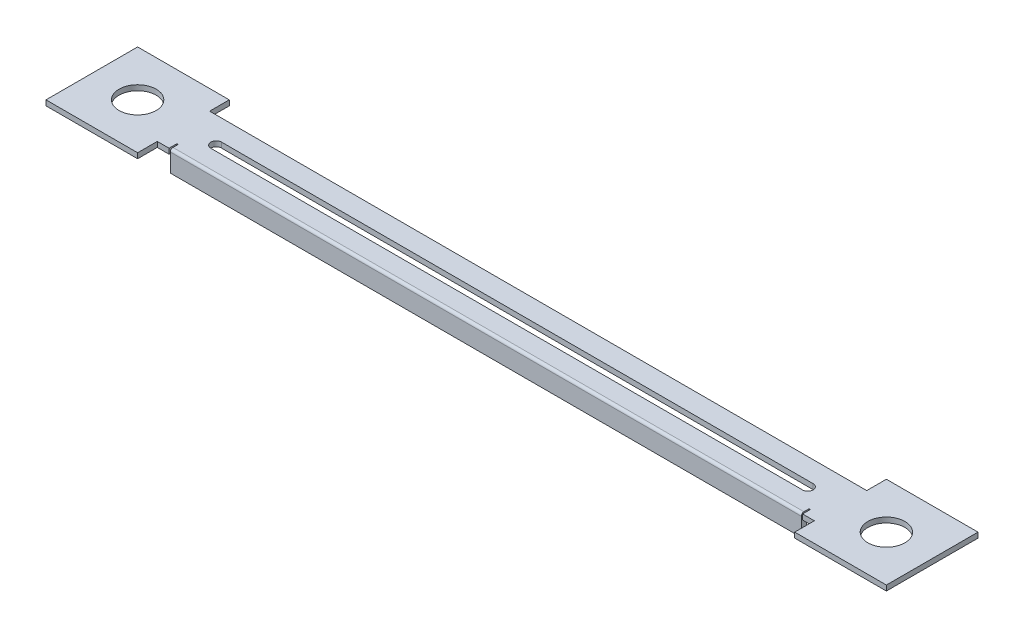
ISO-10303-21;
HEADER;
FILE_DESCRIPTION(('STEP AP214'),'2;1');
FILE_NAME('part.step','',(''),(''),'','','');
FILE_SCHEMA(('AUTOMOTIVE_DESIGN { 1 0 10303 214 1 1 1 1 }'));
ENDSEC;
DATA;
#1=APPLICATION_CONTEXT('core data for automotive mechanical design processes');
#2=APPLICATION_PROTOCOL_DEFINITION('international standard','automotive_design',2000,#1);
#3=PRODUCT_CONTEXT('',#1,'mechanical');
#4=PRODUCT('Part','Part','',(#3));
#5=PRODUCT_RELATED_PRODUCT_CATEGORY('part','',(#4));
#6=PRODUCT_DEFINITION_FORMATION('','',#4);
#7=PRODUCT_DEFINITION_CONTEXT('part definition',#1,'design');
#8=PRODUCT_DEFINITION('design','',#6,#7);
#9=PRODUCT_DEFINITION_SHAPE('','',#8);
#10=(LENGTH_UNIT() NAMED_UNIT(*) SI_UNIT(.MILLI.,.METRE.));
#11=(NAMED_UNIT(*) PLANE_ANGLE_UNIT() SI_UNIT($,.RADIAN.));
#12=(NAMED_UNIT(*) SI_UNIT($,.STERADIAN.) SOLID_ANGLE_UNIT());
#13=UNCERTAINTY_MEASURE_WITH_UNIT(LENGTH_MEASURE(1.E-05),#10,'distance_accuracy_value','');
#14=(GEOMETRIC_REPRESENTATION_CONTEXT(3) GLOBAL_UNCERTAINTY_ASSIGNED_CONTEXT((#13)) GLOBAL_UNIT_ASSIGNED_CONTEXT((#10,
#11,#12)) REPRESENTATION_CONTEXT('',''));
#15=CARTESIAN_POINT('',(0.,0.,0.));
#16=DIRECTION('',(0.,0.,1.));
#17=DIRECTION('',(1.,0.,0.));
#18=AXIS2_PLACEMENT_3D('',#15,#16,#17);
#19=CARTESIAN_POINT('',(17.5,2.,10.));
#20=DIRECTION('',(0.,0.,-1.));
#21=DIRECTION('',(-1.,0.,0.));
#22=AXIS2_PLACEMENT_3D('',#19,#20,#21);
#23=PLANE('',#22);
#24=DIRECTION('',(1.,0.,0.));
#25=VECTOR('',#24,1.);
#26=CARTESIAN_POINT('',(17.5,0.,10.));
#27=LINE('',#26,#25);
#28=CARTESIAN_POINT('',(17.5,0.,10.));
#29=VERTEX_POINT('',#28);
#30=CARTESIAN_POINT('',(22.,0.,10.));
#31=VERTEX_POINT('',#30);
#32=EDGE_CURVE('E429',#29,#31,#27,.T.);
#33=ORIENTED_EDGE('',*,*,#32,.T.);
#34=DIRECTION('',(0.,-1.,0.));
#35=VECTOR('',#34,1.);
#36=CARTESIAN_POINT('',(22.,2.,10.));
#37=LINE('',#36,#35);
#38=CARTESIAN_POINT('',(22.,2.,10.));
#39=VERTEX_POINT('',#38);
#40=EDGE_CURVE('E278',#39,#31,#37,.T.);
#41=ORIENTED_EDGE('',*,*,#40,.F.);
#42=DIRECTION('',(1.,0.,0.));
#43=VECTOR('',#42,1.);
#44=CARTESIAN_POINT('',(17.5,2.,10.));
#45=LINE('',#44,#43);
#46=CARTESIAN_POINT('',(17.5,2.,10.));
#47=VERTEX_POINT('',#46);
#48=EDGE_CURVE('E390',#47,#39,#45,.T.);
#49=ORIENTED_EDGE('',*,*,#48,.F.);
#50=DIRECTION('',(0.,-1.,0.));
#51=VECTOR('',#50,1.);
#52=CARTESIAN_POINT('',(17.5,2.,10.));
#53=LINE('',#52,#51);
#54=EDGE_CURVE('E505',#47,#29,#53,.T.);
#55=ORIENTED_EDGE('',*,*,#54,.T.);
#56=EDGE_LOOP('',(#33,#41,#49,#55));
#57=FACE_BOUND('',#56,.T.);
#58=ADVANCED_FACE('F39',(#57),#23,.F.);
#59=CARTESIAN_POINT('',(264.,2.,10.));
#60=VERTEX_POINT('',#59);
#61=CARTESIAN_POINT('',(268.5,2.,10.));
#62=VERTEX_POINT('',#61);
#63=EDGE_CURVE('E388',#60,#62,#45,.T.);
#64=ORIENTED_EDGE('',*,*,#63,.F.);
#65=DIRECTION('',(0.,1.,0.));
#66=VECTOR('',#65,1.);
#67=CARTESIAN_POINT('',(264.,2.,10.));
#68=LINE('',#67,#66);
#69=CARTESIAN_POINT('',(264.,0.,10.));
#70=VERTEX_POINT('',#69);
#71=EDGE_CURVE('E267',#70,#60,#68,.T.);
#72=ORIENTED_EDGE('',*,*,#71,.F.);
#73=CARTESIAN_POINT('',(268.5,0.,10.));
#74=VERTEX_POINT('',#73);
#75=EDGE_CURVE('E428',#70,#74,#27,.T.);
#76=ORIENTED_EDGE('',*,*,#75,.T.);
#77=DIRECTION('',(0.,-1.,0.));
#78=VECTOR('',#77,1.);
#79=CARTESIAN_POINT('',(268.5,2.,10.));
#80=LINE('',#79,#78);
#81=EDGE_CURVE('E501',#62,#74,#80,.T.);
#82=ORIENTED_EDGE('',*,*,#81,.F.);
#83=EDGE_LOOP('',(#64,#72,#76,#82));
#84=FACE_BOUND('',#83,.T.);
#85=ADVANCED_FACE('F572',(#84),#23,.F.);
#86=CARTESIAN_POINT('',(0.,0.,0.));
#87=DIRECTION('',(0.,1.,0.));
#88=DIRECTION('',(0.,0.,1.));
#89=AXIS2_PLACEMENT_3D('',#86,#87,#88);
#90=PLANE('',#89);
#91=DIRECTION('',(1.,0.,0.));
#92=VECTOR('',#91,1.);
#93=CARTESIAN_POINT('',(30.,0.,-2.05));
#94=LINE('',#93,#92);
#95=CARTESIAN_POINT('',(30.,0.,-2.05));
#96=VERTEX_POINT('',#95);
#97=CARTESIAN_POINT('',(256.,0.,-2.05));
#98=VERTEX_POINT('',#97);
#99=EDGE_CURVE('E258',#96,#98,#94,.T.);
#100=ORIENTED_EDGE('',*,*,#99,.F.);
#101=CARTESIAN_POINT('',(30.,0.,0.));
#102=DIRECTION('',(0.,-1.,0.));
#103=DIRECTION('',(0.,0.,-1.));
#104=AXIS2_PLACEMENT_3D('',#101,#102,#103);
#105=CIRCLE('',#104,2.05);
#106=CARTESIAN_POINT('',(30.,0.,2.05));
#107=VERTEX_POINT('',#106);
#108=EDGE_CURVE('E55',#107,#96,#105,.T.);
#109=ORIENTED_EDGE('',*,*,#108,.F.);
#110=DIRECTION('',(-1.,0.,0.));
#111=VECTOR('',#110,1.);
#112=CARTESIAN_POINT('',(30.,0.,2.05));
#113=LINE('',#112,#111);
#114=CARTESIAN_POINT('',(256.,0.,2.05));
#115=VERTEX_POINT('',#114);
#116=EDGE_CURVE('E245',#115,#107,#113,.T.);
#117=ORIENTED_EDGE('',*,*,#116,.F.);
#118=CARTESIAN_POINT('',(256.,0.,0.));
#119=DIRECTION('',(0.,-1.,0.));
#120=DIRECTION('',(0.,0.,-1.));
#121=AXIS2_PLACEMENT_3D('',#118,#119,#120);
#122=CIRCLE('',#121,2.05);
#123=EDGE_CURVE('E249',#98,#115,#122,.T.);
#124=ORIENTED_EDGE('',*,*,#123,.F.);
#125=EDGE_LOOP('',(#100,#109,#117,#124));
#126=FACE_BOUND('',#125,.T.);
#127=DIRECTION('',(0.,0.,1.));
#128=VECTOR('',#127,1.);
#129=CARTESIAN_POINT('',(263.5,0.,7.));
#130=LINE('',#129,#128);
#131=CARTESIAN_POINT('',(263.5,0.,7.));
#132=VERTEX_POINT('',#131);
#133=CARTESIAN_POINT('',(263.5,0.,7.3));
#134=VERTEX_POINT('',#133);
#135=EDGE_CURVE('E332',#132,#134,#130,.T.);
#136=ORIENTED_EDGE('',*,*,#135,.T.);
#137=DIRECTION('',(1.,0.,0.));
#138=VECTOR('',#137,1.);
#139=CARTESIAN_POINT('',(22.5,0.,7.3));
#140=LINE('',#139,#138);
#141=CARTESIAN_POINT('',(22.5,0.,7.3));
#142=VERTEX_POINT('',#141);
#143=EDGE_CURVE('E526',#134,#142,#140,.F.);
#144=ORIENTED_EDGE('',*,*,#143,.T.);
#145=DIRECTION('',(0.,0.,1.));
#146=VECTOR('',#145,1.);
#147=CARTESIAN_POINT('',(22.5,0.,7.));
#148=LINE('',#147,#146);
#149=CARTESIAN_POINT('',(22.5,0.,7.));
#150=VERTEX_POINT('',#149);
#151=EDGE_CURVE('E289',#150,#142,#148,.T.);
#152=ORIENTED_EDGE('',*,*,#151,.F.);
#153=DIRECTION('',(1.,0.,0.));
#154=VECTOR('',#153,1.);
#155=CARTESIAN_POINT('',(22.,0.,7.));
#156=LINE('',#155,#154);
#157=CARTESIAN_POINT('',(22.,0.,7.));
#158=VERTEX_POINT('',#157);
#159=EDGE_CURVE('E273',#158,#150,#156,.T.);
#160=ORIENTED_EDGE('',*,*,#159,.F.);
#161=DIRECTION('',(0.,0.,1.));
#162=VECTOR('',#161,1.);
#163=CARTESIAN_POINT('',(22.,0.,7.));
#164=LINE('',#163,#162);
#165=EDGE_CURVE('E293',#158,#31,#164,.T.);
#166=ORIENTED_EDGE('',*,*,#165,.T.);
#167=ORIENTED_EDGE('',*,*,#32,.F.);
#168=DIRECTION('',(0.,0.,-1.));
#169=VECTOR('',#168,1.);
#170=CARTESIAN_POINT('',(17.5,0.,10.));
#171=LINE('',#170,#169);
#172=CARTESIAN_POINT('',(17.5,0.,17.5));
#173=VERTEX_POINT('',#172);
#174=EDGE_CURVE('E380',#173,#29,#171,.T.);
#175=ORIENTED_EDGE('',*,*,#174,.F.);
#176=DIRECTION('',(1.,0.,0.));
#177=VECTOR('',#176,1.);
#178=CARTESIAN_POINT('',(-17.5,0.,17.5));
#179=LINE('',#178,#177);
#180=CARTESIAN_POINT('',(-17.5,0.,17.5));
#181=VERTEX_POINT('',#180);
#182=EDGE_CURVE('E389',#181,#173,#179,.T.);
#183=ORIENTED_EDGE('',*,*,#182,.F.);
#184=DIRECTION('',(0.,0.,1.));
#185=VECTOR('',#184,1.);
#186=CARTESIAN_POINT('',(-17.5,0.,-17.5));
#187=LINE('',#186,#185);
#188=CARTESIAN_POINT('',(-17.5,0.,-17.5));
#189=VERTEX_POINT('',#188);
#190=EDGE_CURVE('E457',#189,#181,#187,.T.);
#191=ORIENTED_EDGE('',*,*,#190,.F.);
#192=DIRECTION('',(-1.,0.,0.));
#193=VECTOR('',#192,1.);
#194=CARTESIAN_POINT('',(-17.5,0.,-17.5));
#195=LINE('',#194,#193);
#196=CARTESIAN_POINT('',(17.5,0.,-17.5));
#197=VERTEX_POINT('',#196);
#198=EDGE_CURVE('E454',#197,#189,#195,.T.);
#199=ORIENTED_EDGE('',*,*,#198,.F.);
#200=DIRECTION('',(0.,0.,-1.));
#201=VECTOR('',#200,1.);
#202=CARTESIAN_POINT('',(17.5,0.,-17.5));
#203=LINE('',#202,#201);
#204=CARTESIAN_POINT('',(17.5,0.,-10.));
#205=VERTEX_POINT('',#204);
#206=EDGE_CURVE('E451',#205,#197,#203,.T.);
#207=ORIENTED_EDGE('',*,*,#206,.F.);
#208=DIRECTION('',(-1.,0.,0.));
#209=VECTOR('',#208,1.);
#210=CARTESIAN_POINT('',(17.5,0.,-10.));
#211=LINE('',#210,#209);
#212=CARTESIAN_POINT('',(268.5,0.,-10.));
#213=VERTEX_POINT('',#212);
#214=EDGE_CURVE('E448',#213,#205,#211,.T.);
#215=ORIENTED_EDGE('',*,*,#214,.F.);
#216=DIRECTION('',(0.,0.,1.));
#217=VECTOR('',#216,1.);
#218=CARTESIAN_POINT('',(268.5,0.,-17.5));
#219=LINE('',#218,#217);
#220=CARTESIAN_POINT('',(268.5,0.,-17.5));
#221=VERTEX_POINT('',#220);
#222=EDGE_CURVE('E445',#221,#213,#219,.T.);
#223=ORIENTED_EDGE('',*,*,#222,.F.);
#224=DIRECTION('',(-1.,0.,0.));
#225=VECTOR('',#224,1.);
#226=CARTESIAN_POINT('',(303.5,0.,-17.5));
#227=LINE('',#226,#225);
#228=CARTESIAN_POINT('',(303.5,0.,-17.5));
#229=VERTEX_POINT('',#228);
#230=EDGE_CURVE('E442',#229,#221,#227,.T.);
#231=ORIENTED_EDGE('',*,*,#230,.F.);
#232=DIRECTION('',(0.,0.,-1.));
#233=VECTOR('',#232,1.);
#234=CARTESIAN_POINT('',(303.5,0.,-17.5));
#235=LINE('',#234,#233);
#236=CARTESIAN_POINT('',(303.5,0.,17.5));
#237=VERTEX_POINT('',#236);
#238=EDGE_CURVE('E439',#237,#229,#235,.T.);
#239=ORIENTED_EDGE('',*,*,#238,.F.);
#240=DIRECTION('',(1.,0.,0.));
#241=VECTOR('',#240,1.);
#242=CARTESIAN_POINT('',(303.5,0.,17.5));
#243=LINE('',#242,#241);
#244=CARTESIAN_POINT('',(268.5,0.,17.5));
#245=VERTEX_POINT('',#244);
#246=EDGE_CURVE('E436',#245,#237,#243,.T.);
#247=ORIENTED_EDGE('',*,*,#246,.F.);
#248=DIRECTION('',(0.,0.,1.));
#249=VECTOR('',#248,1.);
#250=CARTESIAN_POINT('',(268.5,0.,10.));
#251=LINE('',#250,#249);
#252=EDGE_CURVE('E433',#74,#245,#251,.T.);
#253=ORIENTED_EDGE('',*,*,#252,.F.);
#254=ORIENTED_EDGE('',*,*,#75,.F.);
#255=DIRECTION('',(0.,0.,1.));
#256=VECTOR('',#255,1.);
#257=CARTESIAN_POINT('',(264.,0.,7.));
#258=LINE('',#257,#256);
#259=CARTESIAN_POINT('',(264.,0.,7.));
#260=VERTEX_POINT('',#259);
#261=EDGE_CURVE('E329',#260,#70,#258,.T.);
#262=ORIENTED_EDGE('',*,*,#261,.F.);
#263=DIRECTION('',(1.,0.,0.));
#264=VECTOR('',#263,1.);
#265=CARTESIAN_POINT('',(264.,0.,7.));
#266=LINE('',#265,#264);
#267=EDGE_CURVE('E316',#132,#260,#266,.T.);
#268=ORIENTED_EDGE('',*,*,#267,.F.);
#269=EDGE_LOOP('',(#136,#144,#152,#160,#166,#167,#175,#183,#191,#199,#207,#215,#223,#231,#239,
#247,#253,#254,#262,#268));
#270=FACE_BOUND('',#269,.T.);
#271=CARTESIAN_POINT('',(286.,0.,0.));
#272=DIRECTION('',(0.,1.,0.));
#273=DIRECTION('',(0.,0.,1.));
#274=AXIS2_PLACEMENT_3D('',#271,#272,#273);
#275=CIRCLE('',#274,7.07500000000002);
#276=CARTESIAN_POINT('',(286.,0.,7.07500000000002));
#277=VERTEX_POINT('',#276);
#278=EDGE_CURVE('E367',#277,#277,#275,.T.);
#279=ORIENTED_EDGE('',*,*,#278,.T.);
#280=EDGE_LOOP('',(#279));
#281=FACE_BOUND('',#280,.T.);
#282=CARTESIAN_POINT('',(0.,0.,0.));
#283=DIRECTION('',(0.,1.,0.));
#284=DIRECTION('',(0.,0.,1.));
#285=AXIS2_PLACEMENT_3D('',#282,#283,#284);
#286=CIRCLE('',#285,7.075);
#287=CARTESIAN_POINT('',(0.,0.,7.075));
#288=VERTEX_POINT('',#287);
#289=EDGE_CURVE('E372',#288,#288,#286,.T.);
#290=ORIENTED_EDGE('',*,*,#289,.T.);
#291=EDGE_LOOP('',(#290));
#292=FACE_BOUND('',#291,.T.);
#293=ADVANCED_FACE('F538',(#126,#270,#281,#292),#90,.F.);
#294=CARTESIAN_POINT('',(0.,2.,0.));
#295=DIRECTION('',(0.,1.,0.));
#296=DIRECTION('',(0.,0.,1.));
#297=AXIS2_PLACEMENT_3D('',#294,#295,#296);
#298=PLANE('',#297);
#299=CARTESIAN_POINT('',(30.,2.,0.));
#300=DIRECTION('',(0.,-1.,0.));
#301=DIRECTION('',(0.,0.,-1.));
#302=AXIS2_PLACEMENT_3D('',#299,#300,#301);
#303=CIRCLE('',#302,2.05);
#304=CARTESIAN_POINT('',(30.,2.,2.05));
#305=VERTEX_POINT('',#304);
#306=CARTESIAN_POINT('',(30.,2.,-2.05));
#307=VERTEX_POINT('',#306);
#308=EDGE_CURVE('E226',#305,#307,#303,.T.);
#309=ORIENTED_EDGE('',*,*,#308,.T.);
#310=DIRECTION('',(1.,0.,0.));
#311=VECTOR('',#310,1.);
#312=CARTESIAN_POINT('',(30.,2.,-2.05));
#313=LINE('',#312,#311);
#314=CARTESIAN_POINT('',(256.,2.,-2.05));
#315=VERTEX_POINT('',#314);
#316=EDGE_CURVE('E236',#307,#315,#313,.T.);
#317=ORIENTED_EDGE('',*,*,#316,.T.);
#318=CARTESIAN_POINT('',(256.,2.,0.));
#319=DIRECTION('',(0.,-1.,0.));
#320=DIRECTION('',(0.,0.,-1.));
#321=AXIS2_PLACEMENT_3D('',#318,#319,#320);
#322=CIRCLE('',#321,2.05);
#323=CARTESIAN_POINT('',(256.,2.,2.05));
#324=VERTEX_POINT('',#323);
#325=EDGE_CURVE('E63',#315,#324,#322,.T.);
#326=ORIENTED_EDGE('',*,*,#325,.T.);
#327=DIRECTION('',(-1.,0.,0.));
#328=VECTOR('',#327,1.);
#329=CARTESIAN_POINT('',(30.,2.,2.05));
#330=LINE('',#329,#328);
#331=EDGE_CURVE('E233',#324,#305,#330,.T.);
#332=ORIENTED_EDGE('',*,*,#331,.T.);
#333=EDGE_LOOP('',(#309,#317,#326,#332));
#334=FACE_BOUND('',#333,.T.);
#335=DIRECTION('',(0.,0.,1.));
#336=VECTOR('',#335,1.);
#337=CARTESIAN_POINT('',(22.5,2.,7.));
#338=LINE('',#337,#336);
#339=CARTESIAN_POINT('',(22.5,2.,7.));
#340=VERTEX_POINT('',#339);
#341=CARTESIAN_POINT('',(22.5,2.,9.));
#342=VERTEX_POINT('',#341);
#343=EDGE_CURVE('E301',#340,#342,#338,.T.);
#344=ORIENTED_EDGE('',*,*,#343,.T.);
#345=DIRECTION('',(1.,0.,0.));
#346=VECTOR('',#345,1.);
#347=CARTESIAN_POINT('',(263.5,2.,9.));
#348=LINE('',#347,#346);
#349=CARTESIAN_POINT('',(263.5,2.,9.));
#350=VERTEX_POINT('',#349);
#351=EDGE_CURVE('E509',#342,#350,#348,.T.);
#352=ORIENTED_EDGE('',*,*,#351,.T.);
#353=DIRECTION('',(0.,0.,1.));
#354=VECTOR('',#353,1.);
#355=CARTESIAN_POINT('',(263.5,2.,7.));
#356=LINE('',#355,#354);
#357=CARTESIAN_POINT('',(263.5,2.,7.));
#358=VERTEX_POINT('',#357);
#359=EDGE_CURVE('E323',#358,#350,#356,.T.);
#360=ORIENTED_EDGE('',*,*,#359,.F.);
#361=DIRECTION('',(-1.,0.,0.));
#362=VECTOR('',#361,1.);
#363=CARTESIAN_POINT('',(263.5,2.,7.));
#364=LINE('',#363,#362);
#365=CARTESIAN_POINT('',(264.,2.,7.));
#366=VERTEX_POINT('',#365);
#367=EDGE_CURVE('E308',#366,#358,#364,.T.);
#368=ORIENTED_EDGE('',*,*,#367,.F.);
#369=DIRECTION('',(0.,0.,1.));
#370=VECTOR('',#369,1.);
#371=CARTESIAN_POINT('',(264.,2.,7.));
#372=LINE('',#371,#370);
#373=EDGE_CURVE('E292',#366,#60,#372,.T.);
#374=ORIENTED_EDGE('',*,*,#373,.T.);
#375=ORIENTED_EDGE('',*,*,#63,.T.);
#376=DIRECTION('',(0.,0.,1.));
#377=VECTOR('',#376,1.);
#378=CARTESIAN_POINT('',(268.5,2.,10.));
#379=LINE('',#378,#377);
#380=CARTESIAN_POINT('',(268.5,2.,17.5));
#381=VERTEX_POINT('',#380);
#382=EDGE_CURVE('E394',#62,#381,#379,.T.);
#383=ORIENTED_EDGE('',*,*,#382,.T.);
#384=DIRECTION('',(1.,0.,0.));
#385=VECTOR('',#384,1.);
#386=CARTESIAN_POINT('',(303.5,2.,17.5));
#387=LINE('',#386,#385);
#388=CARTESIAN_POINT('',(303.5,2.,17.5));
#389=VERTEX_POINT('',#388);
#390=EDGE_CURVE('E397',#381,#389,#387,.T.);
#391=ORIENTED_EDGE('',*,*,#390,.T.);
#392=DIRECTION('',(0.,0.,-1.));
#393=VECTOR('',#392,1.);
#394=CARTESIAN_POINT('',(303.5,2.,-17.5));
#395=LINE('',#394,#393);
#396=CARTESIAN_POINT('',(303.5,2.,-17.5));
#397=VERTEX_POINT('',#396);
#398=EDGE_CURVE('E400',#389,#397,#395,.T.);
#399=ORIENTED_EDGE('',*,*,#398,.T.);
#400=DIRECTION('',(-1.,0.,0.));
#401=VECTOR('',#400,1.);
#402=CARTESIAN_POINT('',(303.5,2.,-17.5));
#403=LINE('',#402,#401);
#404=CARTESIAN_POINT('',(268.5,2.,-17.5));
#405=VERTEX_POINT('',#404);
#406=EDGE_CURVE('E403',#397,#405,#403,.T.);
#407=ORIENTED_EDGE('',*,*,#406,.T.);
#408=DIRECTION('',(0.,0.,1.));
#409=VECTOR('',#408,1.);
#410=CARTESIAN_POINT('',(268.5,2.,-17.5));
#411=LINE('',#410,#409);
#412=CARTESIAN_POINT('',(268.5,2.,-10.));
#413=VERTEX_POINT('',#412);
#414=EDGE_CURVE('E406',#405,#413,#411,.T.);
#415=ORIENTED_EDGE('',*,*,#414,.T.);
#416=DIRECTION('',(-1.,0.,0.));
#417=VECTOR('',#416,1.);
#418=CARTESIAN_POINT('',(17.5,2.,-10.));
#419=LINE('',#418,#417);
#420=CARTESIAN_POINT('',(17.5,2.,-10.));
#421=VERTEX_POINT('',#420);
#422=EDGE_CURVE('E409',#413,#421,#419,.T.);
#423=ORIENTED_EDGE('',*,*,#422,.T.);
#424=DIRECTION('',(0.,0.,-1.));
#425=VECTOR('',#424,1.);
#426=CARTESIAN_POINT('',(17.5,2.,-17.5));
#427=LINE('',#426,#425);
#428=CARTESIAN_POINT('',(17.5,2.,-17.5));
#429=VERTEX_POINT('',#428);
#430=EDGE_CURVE('E412',#421,#429,#427,.T.);
#431=ORIENTED_EDGE('',*,*,#430,.T.);
#432=DIRECTION('',(-1.,0.,0.));
#433=VECTOR('',#432,1.);
#434=CARTESIAN_POINT('',(-17.5,2.,-17.5));
#435=LINE('',#434,#433);
#436=CARTESIAN_POINT('',(-17.5,2.,-17.5));
#437=VERTEX_POINT('',#436);
#438=EDGE_CURVE('E415',#429,#437,#435,.T.);
#439=ORIENTED_EDGE('',*,*,#438,.T.);
#440=DIRECTION('',(0.,0.,1.));
#441=VECTOR('',#440,1.);
#442=CARTESIAN_POINT('',(-17.5,2.,-17.5));
#443=LINE('',#442,#441);
#444=CARTESIAN_POINT('',(-17.5,2.,17.5));
#445=VERTEX_POINT('',#444);
#446=EDGE_CURVE('E418',#437,#445,#443,.T.);
#447=ORIENTED_EDGE('',*,*,#446,.T.);
#448=DIRECTION('',(1.,0.,0.));
#449=VECTOR('',#448,1.);
#450=CARTESIAN_POINT('',(-17.5,2.,17.5));
#451=LINE('',#450,#449);
#452=CARTESIAN_POINT('',(17.5,2.,17.5));
#453=VERTEX_POINT('',#452);
#454=EDGE_CURVE('E421',#445,#453,#451,.T.);
#455=ORIENTED_EDGE('',*,*,#454,.T.);
#456=DIRECTION('',(0.,0.,-1.));
#457=VECTOR('',#456,1.);
#458=CARTESIAN_POINT('',(17.5,2.,10.));
#459=LINE('',#458,#457);
#460=EDGE_CURVE('E384',#453,#47,#459,.T.);
#461=ORIENTED_EDGE('',*,*,#460,.T.);
#462=ORIENTED_EDGE('',*,*,#48,.T.);
#463=DIRECTION('',(0.,0.,1.));
#464=VECTOR('',#463,1.);
#465=CARTESIAN_POINT('',(22.,2.,7.));
#466=LINE('',#465,#464);
#467=CARTESIAN_POINT('',(22.,2.,7.));
#468=VERTEX_POINT('',#467);
#469=EDGE_CURVE('E298',#468,#39,#466,.T.);
#470=ORIENTED_EDGE('',*,*,#469,.F.);
#471=DIRECTION('',(-1.,0.,0.));
#472=VECTOR('',#471,1.);
#473=CARTESIAN_POINT('',(22.5,2.,7.));
#474=LINE('',#473,#472);
#475=EDGE_CURVE('E282',#340,#468,#474,.T.);
#476=ORIENTED_EDGE('',*,*,#475,.F.);
#477=EDGE_LOOP('',(#344,#352,#360,#368,#374,#375,#383,#391,#399,#407,#415,#423,#431,#439,#447,
#455,#461,#462,#470,#476));
#478=FACE_BOUND('',#477,.T.);
#479=CARTESIAN_POINT('',(0.,2.,0.));
#480=DIRECTION('',(0.,1.,0.));
#481=DIRECTION('',(0.,0.,1.));
#482=AXIS2_PLACEMENT_3D('',#479,#480,#481);
#483=CIRCLE('',#482,7.075);
#484=CARTESIAN_POINT('',(0.,2.,7.075));
#485=VERTEX_POINT('',#484);
#486=EDGE_CURVE('E376',#485,#485,#483,.T.);
#487=ORIENTED_EDGE('',*,*,#486,.F.);
#488=EDGE_LOOP('',(#487));
#489=FACE_BOUND('',#488,.T.);
#490=CARTESIAN_POINT('',(286.,2.,0.));
#491=DIRECTION('',(0.,1.,0.));
#492=DIRECTION('',(0.,0.,1.));
#493=AXIS2_PLACEMENT_3D('',#490,#491,#492);
#494=CIRCLE('',#493,7.07500000000002);
#495=CARTESIAN_POINT('',(286.,2.,7.07500000000002));
#496=VERTEX_POINT('',#495);
#497=EDGE_CURVE('E368',#496,#496,#494,.T.);
#498=ORIENTED_EDGE('',*,*,#497,.F.);
#499=EDGE_LOOP('',(#498));
#500=FACE_BOUND('',#499,.T.);
#501=ADVANCED_FACE('F241',(#334,#478,#489,#500),#298,.T.);
#502=CARTESIAN_POINT('',(17.5,2.,10.));
#503=DIRECTION('',(-1.,0.,0.));
#504=DIRECTION('',(0.,0.,1.));
#505=AXIS2_PLACEMENT_3D('',#502,#503,#504);
#506=PLANE('',#505);
#507=ORIENTED_EDGE('',*,*,#174,.T.);
#508=ORIENTED_EDGE('',*,*,#54,.F.);
#509=ORIENTED_EDGE('',*,*,#460,.F.);
#510=DIRECTION('',(0.,-1.,0.));
#511=VECTOR('',#510,1.);
#512=CARTESIAN_POINT('',(17.5,2.,17.5));
#513=LINE('',#512,#511);
#514=EDGE_CURVE('E424',#453,#173,#513,.T.);
#515=ORIENTED_EDGE('',*,*,#514,.T.);
#516=EDGE_LOOP('',(#507,#508,#509,#515));
#517=FACE_BOUND('',#516,.T.);
#518=ADVANCED_FACE('F630',(#517),#506,.F.);
#519=DIRECTION('',(0.,1.,0.));
#520=VECTOR('',#519,1.);
#521=CARTESIAN_POINT('',(263.5,-6.,10.));
#522=LINE('',#521,#520);
#523=CARTESIAN_POINT('',(263.5,-6.,10.));
#524=VERTEX_POINT('',#523);
#525=CARTESIAN_POINT('',(263.5,1.,10.));
#526=VERTEX_POINT('',#525);
#527=EDGE_CURVE('E355',#524,#526,#522,.T.);
#528=ORIENTED_EDGE('',*,*,#527,.T.);
#529=DIRECTION('',(1.,0.,0.));
#530=VECTOR('',#529,1.);
#531=CARTESIAN_POINT('',(22.5,1.,10.));
#532=LINE('',#531,#530);
#533=CARTESIAN_POINT('',(22.5,1.,10.));
#534=VERTEX_POINT('',#533);
#535=EDGE_CURVE('E516',#526,#534,#532,.F.);
#536=ORIENTED_EDGE('',*,*,#535,.T.);
#537=DIRECTION('',(0.,1.,0.));
#538=VECTOR('',#537,1.);
#539=CARTESIAN_POINT('',(22.5,-6.,10.));
#540=LINE('',#539,#538);
#541=CARTESIAN_POINT('',(22.5,-6.,10.));
#542=VERTEX_POINT('',#541);
#543=EDGE_CURVE('E351',#542,#534,#540,.T.);
#544=ORIENTED_EDGE('',*,*,#543,.F.);
#545=DIRECTION('',(-1.,0.,0.));
#546=VECTOR('',#545,1.);
#547=CARTESIAN_POINT('',(22.5,-6.,10.));
#548=LINE('',#547,#546);
#549=EDGE_CURVE('E348',#524,#542,#548,.T.);
#550=ORIENTED_EDGE('',*,*,#549,.F.);
#551=EDGE_LOOP('',(#528,#536,#544,#550));
#552=FACE_BOUND('',#551,.T.);
#553=ADVANCED_FACE('F650',(#552),#23,.F.);
#554=CARTESIAN_POINT('',(268.5,2.,10.));
#555=DIRECTION('',(1.,0.,0.));
#556=DIRECTION('',(0.,0.,-1.));
#557=AXIS2_PLACEMENT_3D('',#554,#555,#556);
#558=PLANE('',#557);
#559=ORIENTED_EDGE('',*,*,#252,.T.);
#560=DIRECTION('',(0.,-1.,0.));
#561=VECTOR('',#560,1.);
#562=CARTESIAN_POINT('',(268.5,2.,17.5));
#563=LINE('',#562,#561);
#564=EDGE_CURVE('E497',#381,#245,#563,.T.);
#565=ORIENTED_EDGE('',*,*,#564,.F.);
#566=ORIENTED_EDGE('',*,*,#382,.F.);
#567=ORIENTED_EDGE('',*,*,#81,.T.);
#568=EDGE_LOOP('',(#559,#565,#566,#567));
#569=FACE_BOUND('',#568,.T.);
#570=ADVANCED_FACE('F579',(#569),#558,.F.);
#571=CARTESIAN_POINT('',(303.5,2.,17.5));
#572=DIRECTION('',(0.,0.,-1.));
#573=DIRECTION('',(-1.,0.,0.));
#574=AXIS2_PLACEMENT_3D('',#571,#572,#573);
#575=PLANE('',#574);
#576=ORIENTED_EDGE('',*,*,#246,.T.);
#577=DIRECTION('',(0.,-1.,0.));
#578=VECTOR('',#577,1.);
#579=CARTESIAN_POINT('',(303.5,2.,17.5));
#580=LINE('',#579,#578);
#581=EDGE_CURVE('E493',#389,#237,#580,.T.);
#582=ORIENTED_EDGE('',*,*,#581,.F.);
#583=ORIENTED_EDGE('',*,*,#390,.F.);
#584=ORIENTED_EDGE('',*,*,#564,.T.);
#585=EDGE_LOOP('',(#576,#582,#583,#584));
#586=FACE_BOUND('',#585,.T.);
#587=ADVANCED_FACE('F586',(#586),#575,.F.);
#588=CARTESIAN_POINT('',(303.5,2.,-17.5));
#589=DIRECTION('',(-1.,0.,0.));
#590=DIRECTION('',(0.,0.,1.));
#591=AXIS2_PLACEMENT_3D('',#588,#589,#590);
#592=PLANE('',#591);
#593=ORIENTED_EDGE('',*,*,#238,.T.);
#594=DIRECTION('',(0.,-1.,0.));
#595=VECTOR('',#594,1.);
#596=CARTESIAN_POINT('',(303.5,2.,-17.5));
#597=LINE('',#596,#595);
#598=EDGE_CURVE('E489',#397,#229,#597,.T.);
#599=ORIENTED_EDGE('',*,*,#598,.F.);
#600=ORIENTED_EDGE('',*,*,#398,.F.);
#601=ORIENTED_EDGE('',*,*,#581,.T.);
#602=EDGE_LOOP('',(#593,#599,#600,#601));
#603=FACE_BOUND('',#602,.T.);
#604=ADVANCED_FACE('F590',(#603),#592,.F.);
#605=CARTESIAN_POINT('',(303.5,2.,-17.5));
#606=DIRECTION('',(0.,0.,1.));
#607=DIRECTION('',(1.,0.,0.));
#608=AXIS2_PLACEMENT_3D('',#605,#606,#607);
#609=PLANE('',#608);
#610=ORIENTED_EDGE('',*,*,#230,.T.);
#611=DIRECTION('',(0.,-1.,0.));
#612=VECTOR('',#611,1.);
#613=CARTESIAN_POINT('',(268.5,2.,-17.5));
#614=LINE('',#613,#612);
#615=EDGE_CURVE('E485',#405,#221,#614,.T.);
#616=ORIENTED_EDGE('',*,*,#615,.F.);
#617=ORIENTED_EDGE('',*,*,#406,.F.);
#618=ORIENTED_EDGE('',*,*,#598,.T.);
#619=EDGE_LOOP('',(#610,#616,#617,#618));
#620=FACE_BOUND('',#619,.T.);
#621=ADVANCED_FACE('F597',(#620),#609,.F.);
#622=CARTESIAN_POINT('',(268.5,2.,-17.5));
#623=DIRECTION('',(1.,0.,0.));
#624=DIRECTION('',(0.,0.,-1.));
#625=AXIS2_PLACEMENT_3D('',#622,#623,#624);
#626=PLANE('',#625);
#627=ORIENTED_EDGE('',*,*,#222,.T.);
#628=DIRECTION('',(0.,-1.,0.));
#629=VECTOR('',#628,1.);
#630=CARTESIAN_POINT('',(268.5,2.,-10.));
#631=LINE('',#630,#629);
#632=EDGE_CURVE('E481',#413,#213,#631,.T.);
#633=ORIENTED_EDGE('',*,*,#632,.F.);
#634=ORIENTED_EDGE('',*,*,#414,.F.);
#635=ORIENTED_EDGE('',*,*,#615,.T.);
#636=EDGE_LOOP('',(#627,#633,#634,#635));
#637=FACE_BOUND('',#636,.T.);
#638=ADVANCED_FACE('F600',(#637),#626,.F.);
#639=CARTESIAN_POINT('',(17.5,2.,-10.));
#640=DIRECTION('',(0.,0.,1.));
#641=DIRECTION('',(1.,0.,0.));
#642=AXIS2_PLACEMENT_3D('',#639,#640,#641);
#643=PLANE('',#642);
#644=ORIENTED_EDGE('',*,*,#214,.T.);
#645=DIRECTION('',(0.,-1.,0.));
#646=VECTOR('',#645,1.);
#647=CARTESIAN_POINT('',(17.5,2.,-10.));
#648=LINE('',#647,#646);
#649=EDGE_CURVE('E477',#421,#205,#648,.T.);
#650=ORIENTED_EDGE('',*,*,#649,.F.);
#651=ORIENTED_EDGE('',*,*,#422,.F.);
#652=ORIENTED_EDGE('',*,*,#632,.T.);
#653=EDGE_LOOP('',(#644,#650,#651,#652));
#654=FACE_BOUND('',#653,.T.);
#655=ADVANCED_FACE('F605',(#654),#643,.F.);
#656=CARTESIAN_POINT('',(17.5,2.,-17.5));
#657=DIRECTION('',(-1.,0.,0.));
#658=DIRECTION('',(0.,0.,1.));
#659=AXIS2_PLACEMENT_3D('',#656,#657,#658);
#660=PLANE('',#659);
#661=ORIENTED_EDGE('',*,*,#206,.T.);
#662=DIRECTION('',(0.,-1.,0.));
#663=VECTOR('',#662,1.);
#664=CARTESIAN_POINT('',(17.5,2.,-17.5));
#665=LINE('',#664,#663);
#666=EDGE_CURVE('E473',#429,#197,#665,.T.);
#667=ORIENTED_EDGE('',*,*,#666,.F.);
#668=ORIENTED_EDGE('',*,*,#430,.F.);
#669=ORIENTED_EDGE('',*,*,#649,.T.);
#670=EDGE_LOOP('',(#661,#667,#668,#669));
#671=FACE_BOUND('',#670,.T.);
#672=ADVANCED_FACE('F611',(#671),#660,.F.);
#673=CARTESIAN_POINT('',(-17.5,2.,-17.5));
#674=DIRECTION('',(0.,0.,1.));
#675=DIRECTION('',(1.,0.,0.));
#676=AXIS2_PLACEMENT_3D('',#673,#674,#675);
#677=PLANE('',#676);
#678=ORIENTED_EDGE('',*,*,#198,.T.);
#679=DIRECTION('',(0.,-1.,0.));
#680=VECTOR('',#679,1.);
#681=CARTESIAN_POINT('',(-17.5,2.,-17.5));
#682=LINE('',#681,#680);
#683=EDGE_CURVE('E469',#437,#189,#682,.T.);
#684=ORIENTED_EDGE('',*,*,#683,.F.);
#685=ORIENTED_EDGE('',*,*,#438,.F.);
#686=ORIENTED_EDGE('',*,*,#666,.T.);
#687=EDGE_LOOP('',(#678,#684,#685,#686));
#688=FACE_BOUND('',#687,.T.);
#689=ADVANCED_FACE('F615',(#688),#677,.F.);
#690=CARTESIAN_POINT('',(-17.5,2.,-17.5));
#691=DIRECTION('',(1.,0.,0.));
#692=DIRECTION('',(0.,0.,-1.));
#693=AXIS2_PLACEMENT_3D('',#690,#691,#692);
#694=PLANE('',#693);
#695=ORIENTED_EDGE('',*,*,#190,.T.);
#696=DIRECTION('',(0.,-1.,0.));
#697=VECTOR('',#696,1.);
#698=CARTESIAN_POINT('',(-17.5,2.,17.5));
#699=LINE('',#698,#697);
#700=EDGE_CURVE('E465',#445,#181,#699,.T.);
#701=ORIENTED_EDGE('',*,*,#700,.F.);
#702=ORIENTED_EDGE('',*,*,#446,.F.);
#703=ORIENTED_EDGE('',*,*,#683,.T.);
#704=EDGE_LOOP('',(#695,#701,#702,#703));
#705=FACE_BOUND('',#704,.T.);
#706=ADVANCED_FACE('F620',(#705),#694,.F.);
#707=CARTESIAN_POINT('',(-17.5,2.,17.5));
#708=DIRECTION('',(0.,0.,-1.));
#709=DIRECTION('',(-1.,0.,0.));
#710=AXIS2_PLACEMENT_3D('',#707,#708,#709);
#711=PLANE('',#710);
#712=ORIENTED_EDGE('',*,*,#182,.T.);
#713=ORIENTED_EDGE('',*,*,#514,.F.);
#714=ORIENTED_EDGE('',*,*,#454,.F.);
#715=ORIENTED_EDGE('',*,*,#700,.T.);
#716=EDGE_LOOP('',(#712,#713,#714,#715));
#717=FACE_BOUND('',#716,.T.);
#718=ADVANCED_FACE('F626',(#717),#711,.F.);
#719=CARTESIAN_POINT('',(0.,2.,0.));
#720=DIRECTION('',(0.,-1.,0.));
#721=DIRECTION('',(0.,0.,-1.));
#722=AXIS2_PLACEMENT_3D('',#719,#720,#721);
#723=CYLINDRICAL_SURFACE('',#722,7.075);
#724=ORIENTED_EDGE('',*,*,#486,.T.);
#725=EDGE_LOOP('',(#724));
#726=FACE_BOUND('',#725,.T.);
#727=ORIENTED_EDGE('',*,*,#289,.F.);
#728=EDGE_LOOP('',(#727));
#729=FACE_BOUND('',#728,.T.);
#730=ADVANCED_FACE('F671',(#726,#729),#723,.F.);
#731=CARTESIAN_POINT('',(286.,2.,0.));
#732=DIRECTION('',(0.,-1.,0.));
#733=DIRECTION('',(0.,0.,-1.));
#734=AXIS2_PLACEMENT_3D('',#731,#732,#733);
#735=CYLINDRICAL_SURFACE('',#734,7.07500000000002);
#736=ORIENTED_EDGE('',*,*,#497,.T.);
#737=EDGE_LOOP('',(#736));
#738=FACE_BOUND('',#737,.T.);
#739=ORIENTED_EDGE('',*,*,#278,.F.);
#740=EDGE_LOOP('',(#739));
#741=FACE_BOUND('',#740,.T.);
#742=ADVANCED_FACE('F733',(#738,#741),#735,.F.);
#743=CARTESIAN_POINT('',(22.5,-6.,10.));
#744=DIRECTION('',(1.,0.,0.));
#745=DIRECTION('',(0.,0.,-1.));
#746=AXIS2_PLACEMENT_3D('',#743,#744,#745);
#747=PLANE('',#746);
#748=ORIENTED_EDGE('',*,*,#543,.T.);
#749=CARTESIAN_POINT('',(22.5,1.,9.));
#750=DIRECTION('',(1.,0.,0.));
#751=DIRECTION('',(0.,0.,-1.));
#752=AXIS2_PLACEMENT_3D('',#749,#750,#751);
#753=CIRCLE('',#752,1.);
#754=EDGE_CURVE('E519',#534,#342,#753,.F.);
#755=ORIENTED_EDGE('',*,*,#754,.T.);
#756=ORIENTED_EDGE('',*,*,#343,.F.);
#757=DIRECTION('',(0.,1.,0.));
#758=VECTOR('',#757,1.);
#759=CARTESIAN_POINT('',(22.5,0.,7.));
#760=LINE('',#759,#758);
#761=EDGE_CURVE('E277',#150,#340,#760,.T.);
#762=ORIENTED_EDGE('',*,*,#761,.F.);
#763=ORIENTED_EDGE('',*,*,#151,.T.);
#764=CARTESIAN_POINT('',(22.5,-0.7,7.3));
#765=DIRECTION('',(1.,0.,0.));
#766=DIRECTION('',(0.,0.,-1.));
#767=AXIS2_PLACEMENT_3D('',#764,#765,#766);
#768=CIRCLE('',#767,0.7);
#769=CARTESIAN_POINT('',(22.5,-0.7,8.));
#770=VERTEX_POINT('',#769);
#771=EDGE_CURVE('E11',#142,#770,#768,.T.);
#772=ORIENTED_EDGE('',*,*,#771,.T.);
#773=DIRECTION('',(0.,1.,0.));
#774=VECTOR('',#773,1.);
#775=CARTESIAN_POINT('',(22.5,-6.,8.));
#776=LINE('',#775,#774);
#777=CARTESIAN_POINT('',(22.5,-6.,8.));
#778=VERTEX_POINT('',#777);
#779=EDGE_CURVE('E363',#778,#770,#776,.T.);
#780=ORIENTED_EDGE('',*,*,#779,.F.);
#781=DIRECTION('',(0.,0.,-1.));
#782=VECTOR('',#781,1.);
#783=CARTESIAN_POINT('',(22.5,-6.,10.));
#784=LINE('',#783,#782);
#785=EDGE_CURVE('E297',#542,#778,#784,.T.);
#786=ORIENTED_EDGE('',*,*,#785,.F.);
#787=EDGE_LOOP('',(#748,#755,#756,#762,#763,#772,#780,#786));
#788=FACE_BOUND('',#787,.T.);
#789=ADVANCED_FACE('F545',(#788),#747,.F.);
#790=CARTESIAN_POINT('',(22.5,-6.,8.));
#791=DIRECTION('',(0.,0.,1.));
#792=DIRECTION('',(1.,0.,0.));
#793=AXIS2_PLACEMENT_3D('',#790,#791,#792);
#794=PLANE('',#793);
#795=ORIENTED_EDGE('',*,*,#779,.T.);
#796=DIRECTION('',(1.,0.,0.));
#797=VECTOR('',#796,1.);
#798=CARTESIAN_POINT('',(263.5,-0.7,8.));
#799=LINE('',#798,#797);
#800=CARTESIAN_POINT('',(263.5,-0.7,8.));
#801=VERTEX_POINT('',#800);
#802=EDGE_CURVE('E522',#770,#801,#799,.T.);
#803=ORIENTED_EDGE('',*,*,#802,.T.);
#804=DIRECTION('',(0.,1.,0.));
#805=VECTOR('',#804,1.);
#806=CARTESIAN_POINT('',(263.5,-6.,8.));
#807=LINE('',#806,#805);
#808=CARTESIAN_POINT('',(263.5,-6.,8.));
#809=VERTEX_POINT('',#808);
#810=EDGE_CURVE('E359',#809,#801,#807,.T.);
#811=ORIENTED_EDGE('',*,*,#810,.F.);
#812=DIRECTION('',(1.,0.,0.));
#813=VECTOR('',#812,1.);
#814=CARTESIAN_POINT('',(22.5,-6.,8.));
#815=LINE('',#814,#813);
#816=EDGE_CURVE('E342',#778,#809,#815,.T.);
#817=ORIENTED_EDGE('',*,*,#816,.F.);
#818=EDGE_LOOP('',(#795,#803,#811,#817));
#819=FACE_BOUND('',#818,.T.);
#820=ADVANCED_FACE('F548',(#819),#794,.F.);
#821=CARTESIAN_POINT('',(263.5,-6.,10.));
#822=DIRECTION('',(-1.,0.,0.));
#823=DIRECTION('',(0.,0.,1.));
#824=AXIS2_PLACEMENT_3D('',#821,#822,#823);
#825=PLANE('',#824);
#826=ORIENTED_EDGE('',*,*,#359,.T.);
#827=CARTESIAN_POINT('',(263.5,1.,9.));
#828=DIRECTION('',(-1.,0.,0.));
#829=DIRECTION('',(0.,0.,1.));
#830=AXIS2_PLACEMENT_3D('',#827,#828,#829);
#831=CIRCLE('',#830,1.);
#832=EDGE_CURVE('E513',#350,#526,#831,.F.);
#833=ORIENTED_EDGE('',*,*,#832,.T.);
#834=ORIENTED_EDGE('',*,*,#527,.F.);
#835=DIRECTION('',(0.,0.,1.));
#836=VECTOR('',#835,1.);
#837=CARTESIAN_POINT('',(263.5,-6.,10.));
#838=LINE('',#837,#836);
#839=EDGE_CURVE('E345',#809,#524,#838,.T.);
#840=ORIENTED_EDGE('',*,*,#839,.F.);
#841=ORIENTED_EDGE('',*,*,#810,.T.);
#842=CARTESIAN_POINT('',(263.5,-0.7,7.3));
#843=DIRECTION('',(-1.,0.,0.));
#844=DIRECTION('',(0.,0.,1.));
#845=AXIS2_PLACEMENT_3D('',#842,#843,#844);
#846=CIRCLE('',#845,0.7);
#847=EDGE_CURVE('E48',#801,#134,#846,.T.);
#848=ORIENTED_EDGE('',*,*,#847,.T.);
#849=ORIENTED_EDGE('',*,*,#135,.F.);
#850=DIRECTION('',(0.,-1.,0.));
#851=VECTOR('',#850,1.);
#852=CARTESIAN_POINT('',(263.5,0.,7.));
#853=LINE('',#852,#851);
#854=EDGE_CURVE('E312',#358,#132,#853,.T.);
#855=ORIENTED_EDGE('',*,*,#854,.F.);
#856=EDGE_LOOP('',(#826,#833,#834,#840,#841,#848,#849,#855));
#857=FACE_BOUND('',#856,.T.);
#858=ADVANCED_FACE('F530',(#857),#825,.F.);
#859=CARTESIAN_POINT('',(0.,-6.,0.));
#860=DIRECTION('',(0.,-1.,0.));
#861=DIRECTION('',(0.,0.,-1.));
#862=AXIS2_PLACEMENT_3D('',#859,#860,#861);
#863=PLANE('',#862);
#864=ORIENTED_EDGE('',*,*,#785,.T.);
#865=ORIENTED_EDGE('',*,*,#816,.T.);
#866=ORIENTED_EDGE('',*,*,#839,.T.);
#867=ORIENTED_EDGE('',*,*,#549,.T.);
#868=EDGE_LOOP('',(#864,#865,#866,#867));
#869=FACE_BOUND('',#868,.T.);
#870=ADVANCED_FACE('F550',(#869),#863,.T.);
#871=CARTESIAN_POINT('',(264.,2.,7.));
#872=DIRECTION('',(1.,0.,0.));
#873=DIRECTION('',(0.,0.,-1.));
#874=AXIS2_PLACEMENT_3D('',#871,#872,#873);
#875=PLANE('',#874);
#876=ORIENTED_EDGE('',*,*,#71,.T.);
#877=ORIENTED_EDGE('',*,*,#373,.F.);
#878=DIRECTION('',(0.,1.,0.));
#879=VECTOR('',#878,1.);
#880=CARTESIAN_POINT('',(264.,2.,7.));
#881=LINE('',#880,#879);
#882=EDGE_CURVE('E319',#260,#366,#881,.T.);
#883=ORIENTED_EDGE('',*,*,#882,.F.);
#884=ORIENTED_EDGE('',*,*,#261,.T.);
#885=EDGE_LOOP('',(#876,#877,#883,#884));
#886=FACE_BOUND('',#885,.T.);
#887=ADVANCED_FACE('F766',(#886),#875,.F.);
#888=CARTESIAN_POINT('',(0.,0.,7.));
#889=DIRECTION('',(0.,0.,-1.));
#890=DIRECTION('',(-1.,0.,0.));
#891=AXIS2_PLACEMENT_3D('',#888,#889,#890);
#892=PLANE('',#891);
#893=ORIENTED_EDGE('',*,*,#367,.T.);
#894=ORIENTED_EDGE('',*,*,#854,.T.);
#895=ORIENTED_EDGE('',*,*,#267,.T.);
#896=ORIENTED_EDGE('',*,*,#882,.T.);
#897=EDGE_LOOP('',(#893,#894,#895,#896));
#898=FACE_BOUND('',#897,.T.);
#899=ADVANCED_FACE('F565',(#898),#892,.F.);
#900=CARTESIAN_POINT('',(22.,2.,7.));
#901=DIRECTION('',(-1.,0.,0.));
#902=DIRECTION('',(0.,0.,1.));
#903=AXIS2_PLACEMENT_3D('',#900,#901,#902);
#904=PLANE('',#903);
#905=ORIENTED_EDGE('',*,*,#40,.T.);
#906=ORIENTED_EDGE('',*,*,#165,.F.);
#907=DIRECTION('',(0.,-1.,0.));
#908=VECTOR('',#907,1.);
#909=CARTESIAN_POINT('',(22.,2.,7.));
#910=LINE('',#909,#908);
#911=EDGE_CURVE('E285',#468,#158,#910,.T.);
#912=ORIENTED_EDGE('',*,*,#911,.F.);
#913=ORIENTED_EDGE('',*,*,#469,.T.);
#914=EDGE_LOOP('',(#905,#906,#912,#913));
#915=FACE_BOUND('',#914,.T.);
#916=ADVANCED_FACE('F636',(#915),#904,.F.);
#917=CARTESIAN_POINT('',(0.,0.,7.));
#918=DIRECTION('',(0.,0.,1.));
#919=DIRECTION('',(1.,0.,0.));
#920=AXIS2_PLACEMENT_3D('',#917,#918,#919);
#921=PLANE('',#920);
#922=ORIENTED_EDGE('',*,*,#159,.T.);
#923=ORIENTED_EDGE('',*,*,#761,.T.);
#924=ORIENTED_EDGE('',*,*,#475,.T.);
#925=ORIENTED_EDGE('',*,*,#911,.T.);
#926=EDGE_LOOP('',(#922,#923,#924,#925));
#927=FACE_BOUND('',#926,.T.);
#928=ADVANCED_FACE('F639',(#927),#921,.T.);
#929=CARTESIAN_POINT('',(0.,1.,9.));
#930=DIRECTION('',(-1.,0.,0.));
#931=DIRECTION('',(0.,0.,1.));
#932=AXIS2_PLACEMENT_3D('',#929,#930,#931);
#933=CYLINDRICAL_SURFACE('',#932,1.);
#934=ORIENTED_EDGE('',*,*,#754,.F.);
#935=ORIENTED_EDGE('',*,*,#535,.F.);
#936=ORIENTED_EDGE('',*,*,#832,.F.);
#937=ORIENTED_EDGE('',*,*,#351,.F.);
#938=EDGE_LOOP('',(#934,#935,#936,#937));
#939=FACE_BOUND('',#938,.T.);
#940=ADVANCED_FACE('F558',(#939),#933,.T.);
#941=CARTESIAN_POINT('',(22.5,-0.7,7.3));
#942=DIRECTION('',(-1.,0.,0.));
#943=DIRECTION('',(0.,0.,1.));
#944=AXIS2_PLACEMENT_3D('',#941,#942,#943);
#945=CYLINDRICAL_SURFACE('',#944,0.7);
#946=ORIENTED_EDGE('',*,*,#771,.F.);
#947=ORIENTED_EDGE('',*,*,#143,.F.);
#948=ORIENTED_EDGE('',*,*,#847,.F.);
#949=ORIENTED_EDGE('',*,*,#802,.F.);
#950=EDGE_LOOP('',(#946,#947,#948,#949));
#951=FACE_BOUND('',#950,.T.);
#952=ADVANCED_FACE('F41',(#951),#945,.F.);
#953=CARTESIAN_POINT('',(30.,2.,0.));
#954=DIRECTION('',(0.,-1.,0.));
#955=DIRECTION('',(0.,0.,-1.));
#956=AXIS2_PLACEMENT_3D('',#953,#954,#955);
#957=CYLINDRICAL_SURFACE('',#956,2.05);
#958=ORIENTED_EDGE('',*,*,#108,.T.);
#959=DIRECTION('',(0.,-1.,0.));
#960=VECTOR('',#959,1.);
#961=CARTESIAN_POINT('',(30.,2.,-2.05));
#962=LINE('',#961,#960);
#963=EDGE_CURVE('E222',#307,#96,#962,.T.);
#964=ORIENTED_EDGE('',*,*,#963,.F.);
#965=ORIENTED_EDGE('',*,*,#308,.F.);
#966=DIRECTION('',(0.,-1.,0.));
#967=VECTOR('',#966,1.);
#968=CARTESIAN_POINT('',(30.,2.,2.05));
#969=LINE('',#968,#967);
#970=EDGE_CURVE('E264',#305,#107,#969,.T.);
#971=ORIENTED_EDGE('',*,*,#970,.T.);
#972=EDGE_LOOP('',(#958,#964,#965,#971));
#973=FACE_BOUND('',#972,.T.);
#974=ADVANCED_FACE('F224',(#973),#957,.F.);
#975=CARTESIAN_POINT('',(30.,2.,2.05));
#976=DIRECTION('',(0.,0.,1.));
#977=DIRECTION('',(1.,0.,0.));
#978=AXIS2_PLACEMENT_3D('',#975,#976,#977);
#979=PLANE('',#978);
#980=ORIENTED_EDGE('',*,*,#116,.T.);
#981=ORIENTED_EDGE('',*,*,#970,.F.);
#982=ORIENTED_EDGE('',*,*,#331,.F.);
#983=DIRECTION('',(0.,-1.,0.));
#984=VECTOR('',#983,1.);
#985=CARTESIAN_POINT('',(256.,2.,2.05));
#986=LINE('',#985,#984);
#987=EDGE_CURVE('E268',#324,#115,#986,.T.);
#988=ORIENTED_EDGE('',*,*,#987,.T.);
#989=EDGE_LOOP('',(#980,#981,#982,#988));
#990=FACE_BOUND('',#989,.T.);
#991=ADVANCED_FACE('F813',(#990),#979,.F.);
#992=CARTESIAN_POINT('',(256.,2.,0.));
#993=DIRECTION('',(0.,-1.,0.));
#994=DIRECTION('',(0.,0.,-1.));
#995=AXIS2_PLACEMENT_3D('',#992,#993,#994);
#996=CYLINDRICAL_SURFACE('',#995,2.05);
#997=ORIENTED_EDGE('',*,*,#123,.T.);
#998=ORIENTED_EDGE('',*,*,#987,.F.);
#999=ORIENTED_EDGE('',*,*,#325,.F.);
#1000=DIRECTION('',(0.,-1.,0.));
#1001=VECTOR('',#1000,1.);
#1002=CARTESIAN_POINT('',(256.,2.,-2.05));
#1003=LINE('',#1002,#1001);
#1004=EDGE_CURVE('E232',#315,#98,#1003,.T.);
#1005=ORIENTED_EDGE('',*,*,#1004,.T.);
#1006=EDGE_LOOP('',(#997,#998,#999,#1005));
#1007=FACE_BOUND('',#1006,.T.);
#1008=ADVANCED_FACE('F819',(#1007),#996,.F.);
#1009=CARTESIAN_POINT('',(30.,2.,-2.05));
#1010=DIRECTION('',(0.,0.,-1.));
#1011=DIRECTION('',(-1.,0.,0.));
#1012=AXIS2_PLACEMENT_3D('',#1009,#1010,#1011);
#1013=PLANE('',#1012);
#1014=ORIENTED_EDGE('',*,*,#99,.T.);
#1015=ORIENTED_EDGE('',*,*,#1004,.F.);
#1016=ORIENTED_EDGE('',*,*,#316,.F.);
#1017=ORIENTED_EDGE('',*,*,#963,.T.);
#1018=EDGE_LOOP('',(#1014,#1015,#1016,#1017));
#1019=FACE_BOUND('',#1018,.T.);
#1020=ADVANCED_FACE('F237',(#1019),#1013,.F.);
#1021=CLOSED_SHELL('',(#58,#85,#293,#501,#518,#553,#570,#587,#604,#621,#638,#655,#672,#689,#706,
#718,#730,#742,#789,#820,#858,#870,#887,#899,#916,#928,#940,#952,#974,#991,#1008,#1020));
#1022=MANIFOLD_SOLID_BREP('B2',#1021);
#1023=ADVANCED_BREP_SHAPE_REPRESENTATION('',(#18,#1022),#14);
#1024=SHAPE_DEFINITION_REPRESENTATION(#9,#1023);
ENDSEC;
END-ISO-10303-21;
